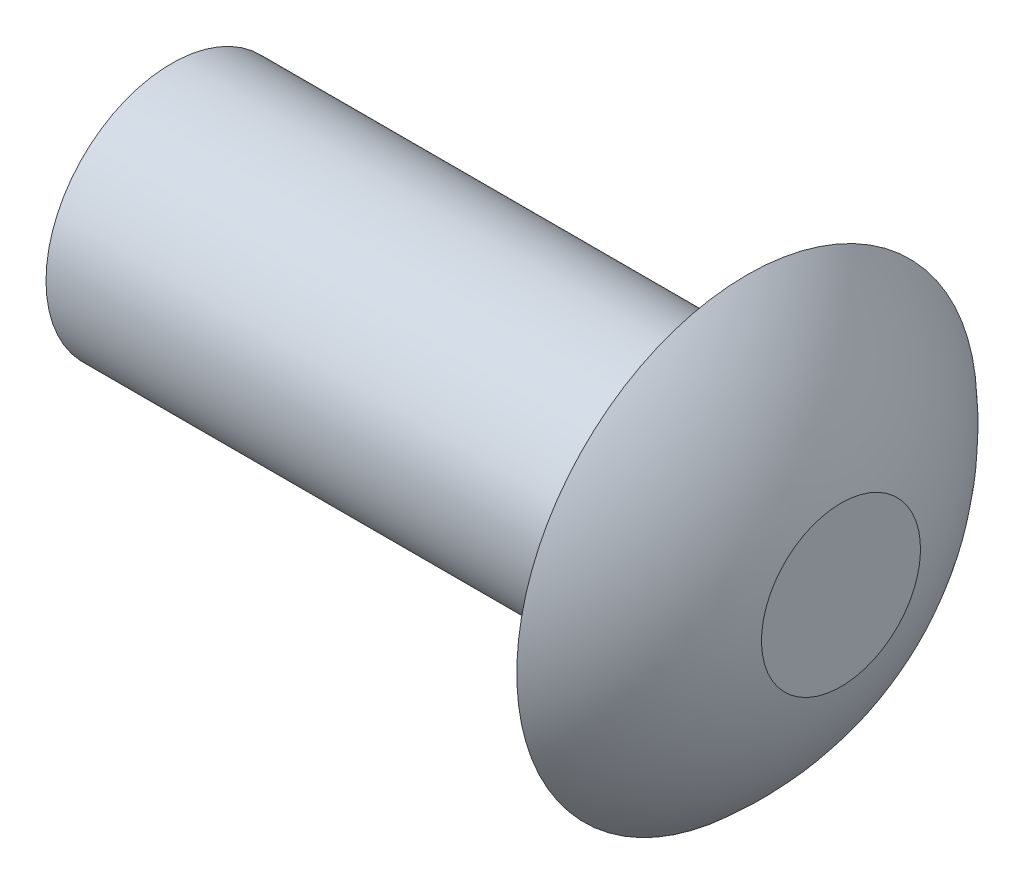
ISO-10303-21;
HEADER;
FILE_DESCRIPTION(('STEP AP214'),'2;1');
FILE_NAME('part.step','',(''),(''),'','','');
FILE_SCHEMA(('AUTOMOTIVE_DESIGN { 1 0 10303 214 1 1 1 1 }'));
ENDSEC;
DATA;
#1=APPLICATION_CONTEXT('core data for automotive mechanical design processes');
#2=APPLICATION_PROTOCOL_DEFINITION('international standard','automotive_design',2000,#1);
#3=PRODUCT_CONTEXT('',#1,'mechanical');
#4=PRODUCT('Part','Part','',(#3));
#5=PRODUCT_RELATED_PRODUCT_CATEGORY('part','',(#4));
#6=PRODUCT_DEFINITION_FORMATION('','',#4);
#7=PRODUCT_DEFINITION_CONTEXT('part definition',#1,'design');
#8=PRODUCT_DEFINITION('design','',#6,#7);
#9=PRODUCT_DEFINITION_SHAPE('','',#8);
#10=(LENGTH_UNIT() NAMED_UNIT(*) SI_UNIT(.MILLI.,.METRE.));
#11=(NAMED_UNIT(*) PLANE_ANGLE_UNIT() SI_UNIT($,.RADIAN.));
#12=(NAMED_UNIT(*) SI_UNIT($,.STERADIAN.) SOLID_ANGLE_UNIT());
#13=UNCERTAINTY_MEASURE_WITH_UNIT(LENGTH_MEASURE(1.E-05),#10,'distance_accuracy_value','');
#14=(GEOMETRIC_REPRESENTATION_CONTEXT(3) GLOBAL_UNCERTAINTY_ASSIGNED_CONTEXT((#13)) GLOBAL_UNIT_ASSIGNED_CONTEXT((#10,
#11,#12)) REPRESENTATION_CONTEXT('',''));
#15=CARTESIAN_POINT('',(0.,0.,0.));
#16=DIRECTION('',(0.,0.,1.));
#17=DIRECTION('',(1.,0.,0.));
#18=AXIS2_PLACEMENT_3D('',#15,#16,#17);
#19=CARTESIAN_POINT('',(-2.4,0.,0.));
#20=DIRECTION('',(-1.,0.,0.));
#21=DIRECTION('',(0.,1.,0.));
#22=AXIS2_PLACEMENT_3D('',#19,#20,#21);
#23=SPHERICAL_SURFACE('',#22,3.65);
#24=CARTESIAN_POINT('',(0.,0.,0.));
#25=DIRECTION('',(-1.,0.,0.));
#26=DIRECTION('',(0.,0.,1.));
#27=AXIS2_PLACEMENT_3D('',#24,#25,#26);
#28=CIRCLE('',#27,2.75);
#29=CARTESIAN_POINT('',(0.,2.75,0.));
#30=VERTEX_POINT('',#29);
#31=EDGE_CURVE('E44',#30,#30,#28,.T.);
#32=CARTESIAN_POINT('',(1.1242020373412,0.,0.));
#33=DIRECTION('',(-1.,0.,0.));
#34=DIRECTION('',(0.,0.,1.));
#35=AXIS2_PLACEMENT_3D('',#32,#33,#34);
#36=CIRCLE('',#35,0.95);
#37=CARTESIAN_POINT('',(1.1242020373412,0.950000000000054,0.));
#38=VERTEX_POINT('',#37);
#39=EDGE_CURVE('E10',#38,#38,#36,.T.);
#40=CARTESIAN_POINT('',(0.,2.75,0.));
#41=CARTESIAN_POINT('',(0.0168995988637001,2.73525129266401,0.));
#42=CARTESIAN_POINT('',(0.0336632114575486,2.72034676895265,0.));
#43=CARTESIAN_POINT('',(0.0669128410145665,2.69023123657844,0.));
#44=CARTESIAN_POINT('',(0.0833988579777359,2.67502022791558,0.));
#45=CARTESIAN_POINT('',(0.11608767318242,2.64429687343758,0.));
#46=CARTESIAN_POINT('',(0.132290471423934,2.62878452762243,0.));
#47=CARTESIAN_POINT('',(0.164407347633022,2.59746377696663,0.));
#48=CARTESIAN_POINT('',(0.180321425600595,2.58165537212598,0.));
#49=CARTESIAN_POINT('',(0.211855451063929,2.54974787468967,0.));
#50=CARTESIAN_POINT('',(0.22747539855969,2.53364878209401,0.));
#51=CARTESIAN_POINT('',(0.258415854663592,2.50116538121903,0.));
#52=CARTESIAN_POINT('',(0.273736363271734,2.48478107293972,0.));
#53=CARTESIAN_POINT('',(0.304072734469466,2.45173280916899,0.));
#54=CARTESIAN_POINT('',(0.319088597059055,2.43506885367756,0.));
#55=CARTESIAN_POINT('',(0.348810572760037,2.40146695914257,0.));
#56=CARTESIAN_POINT('',(0.363516685871429,2.384529020099,0.));
#57=CARTESIAN_POINT('',(0.392614164396958,2.35038491520076,0.));
#58=CARTESIAN_POINT('',(0.407005529811094,2.33317874934609,0.));
#59=CARTESIAN_POINT('',(0.435468621706671,2.2985040387401,0.));
#60=CARTESIAN_POINT('',(0.449540348188112,2.28103549398877,0.));
#61=CARTESIAN_POINT('',(0.477359379617014,2.24584196267665,0.));
#62=CARTESIAN_POINT('',(0.491106684564476,2.22811697611585,0.));
#63=CARTESIAN_POINT('',(0.518272200586947,2.1924165854304,0.));
#64=CARTESIAN_POINT('',(0.531690411661957,2.17444118130574,0.));
#65=CARTESIAN_POINT('',(0.558193179451015,2.13824606484812,0.));
#66=CARTESIAN_POINT('',(0.571277736165062,2.12002635251517,0.));
#67=CARTESIAN_POINT('',(0.597108748143862,2.0833488120304,0.));
#68=CARTESIAN_POINT('',(0.609855203408614,2.06489098387858,0.));
#69=CARTESIAN_POINT('',(0.635005680312052,2.02774348507461,0.));
#70=CARTESIAN_POINT('',(0.647409701950737,2.00905381442247,0.));
#71=CARTESIAN_POINT('',(0.671871095809237,1.97144898273344,0.));
#72=CARTESIAN_POINT('',(0.683928468029051,1.95253382169655,0.));
#73=CARTESIAN_POINT('',(0.707692465073805,1.91448443799172,0.));
#74=CARTESIAN_POINT('',(0.719399089898743,1.89535021532377,0.));
#75=CARTESIAN_POINT('',(0.742457613387331,1.85686921156364,0.));
#76=CARTESIAN_POINT('',(0.753809512050979,1.83752243047146,0.));
#77=CARTESIAN_POINT('',(0.776154725012438,1.79862288531257,0.));
#78=CARTESIAN_POINT('',(0.787148039310248,1.77907012124587,0.));
#79=CARTESIAN_POINT('',(0.80877234720865,1.73976525559573,0.));
#80=CARTESIAN_POINT('',(0.819403340809243,1.72001315401228,0.));
#81=CARTESIAN_POINT('',(0.84029939412486,1.68031632653587,0.));
#82=CARTESIAN_POINT('',(0.850564453839883,1.66037160064291,0.));
#83=CARTESIAN_POINT('',(0.870725150567148,1.62029630322252,0.));
#84=CARTESIAN_POINT('',(0.88062078757939,1.60016573169509,0.));
#85=CARTESIAN_POINT('',(0.900039275640444,1.55972558484469,0.));
#86=CARTESIAN_POINT('',(0.909562126689257,1.53941600952171,0.));
#87=CARTESIAN_POINT('',(0.928231806263677,1.49862475775796,0.));
#88=CARTESIAN_POINT('',(0.937378634789283,1.47814308131718,0.));
#89=CARTESIAN_POINT('',(0.95529316055385,1.43701458848707,0.));
#90=CARTESIAN_POINT('',(0.96406085779281,1.41636777209774,0.));
#91=CARTESIAN_POINT('',(0.981214141090544,1.37491601667028,0.));
#92=CARTESIAN_POINT('',(0.989599727149318,1.35411107763214,0.));
#93=CARTESIAN_POINT('',(1.00598593801247,1.31235014793398,0.));
#94=CARTESIAN_POINT('',(1.01398656281685,1.29139415727395,0.));
#95=CARTESIAN_POINT('',(1.02960013212143,1.24933824675126,0.));
#96=CARTESIAN_POINT('',(1.03721307662163,1.22823832688859,0.));
#97=CARTESIAN_POINT('',(1.05204869733427,1.18590172909613,0.));
#98=CARTESIAN_POINT('',(1.05927137354671,1.16466505116632,0.));
#99=CARTESIAN_POINT('',(1.07332400493903,1.12206215560717,0.));
#100=CARTESIAN_POINT('',(1.08015396011892,1.10069593797782,0.));
#101=CARTESIAN_POINT('',(1.09341882048405,1.05784122260879,0.));
#102=CARTESIAN_POINT('',(1.0998537256693,1.03635272486911,0.));
#103=CARTESIAN_POINT('',(1.1123263275232,0.993260760898373,0.));
#104=CARTESIAN_POINT('',(1.11836402419184,0.971657294667317,0.));
#105=CARTESIAN_POINT('',(1.1242020373412,0.950000000000054,0.));
#106=B_SPLINE_CURVE_WITH_KNOTS('',3,(#40,#41,#42,#43,#44,#45,#46,#47,#48,#49,#50,#51,#52,#53,
#54,#55,#56,#57,#58,#59,#60,#61,#62,#63,#64,#65,#66,#67,#68,#69,#70,#71,#72,#73,#74,#75,#76,#77,
#78,#79,#80,#81,#82,#83,#84,#85,#86,#87,#88,#89,#90,#91,#92,#93,#94,#95,#96,#97,#98,#99,#100,
#101,#102,#103,#104,#105),.UNSPECIFIED.,.F.,.F.,(4,2,2,2,2,2,2,2,2,2,2,2,2,2,2,2,2,2,2,2,2,2,2,
2,2,2,2,2,2,2,2,2,4),(0.,0.0672901096478356,0.134580219295671,0.201870328943508,
0.269160438591343,0.33645054823918,0.403740657887015,0.471030767534852,0.538320877182687,
0.605610986830523,0.672901096478359,0.740191206126195,0.807481315774031,0.874771425421866,
0.942061535069703,1.00935164471754,1.07664175436537,1.14393186401321,1.21122197366105,
1.27851208330888,1.34580219295672,1.41309230260455,1.48038241225239,1.54767252190023,
1.61496263154806,1.6822527411959,1.74954285084373,1.81683296049157,1.88412307013941,
1.95141317978724,2.01870328943508,2.08599339908291,2.15328350873075),.UNSPECIFIED.);
#107=EDGE_CURVE('BSEAM30',#30,#38,#106,.T.);
#108=ORIENTED_EDGE('',*,*,#31,.F.);
#109=ORIENTED_EDGE('',*,*,#39,.T.);
#110=ORIENTED_EDGE('',*,*,#107,.T.);
#111=ORIENTED_EDGE('',*,*,#107,.F.);
#112=EDGE_LOOP('',(#108,#110,#109,#111));
#113=FACE_BOUND('',#112,.T.);
#114=ADVANCED_FACE('F30',(#113),#23,.T.);
#115=CARTESIAN_POINT('',(1.12420203734238,0.,0.));
#116=DIRECTION('',(-1.,0.,0.));
#117=DIRECTION('',(0.,0.,1.));
#118=AXIS2_PLACEMENT_3D('',#115,#116,#117);
#119=PLANE('',#118);
#120=ORIENTED_EDGE('',*,*,#39,.F.);
#121=EDGE_LOOP('',(#120));
#122=FACE_BOUND('',#121,.T.);
#123=ADVANCED_FACE('F53',(#122),#119,.F.);
#124=CARTESIAN_POINT('',(-6.87579796265878,0.,0.));
#125=DIRECTION('',(1.,0.,0.));
#126=DIRECTION('',(0.,0.,-1.));
#127=AXIS2_PLACEMENT_3D('',#124,#125,#126);
#128=PLANE('',#127);
#129=CARTESIAN_POINT('',(-6.8757979626588,0.,0.));
#130=DIRECTION('',(-1.,0.,0.));
#131=DIRECTION('',(0.,0.,1.));
#132=AXIS2_PLACEMENT_3D('',#129,#130,#131);
#133=CIRCLE('',#132,1.5);
#134=CARTESIAN_POINT('',(-6.8757979626588,0.,1.5));
#135=VERTEX_POINT('',#134);
#136=EDGE_CURVE('E36',#135,#135,#133,.T.);
#137=ORIENTED_EDGE('',*,*,#136,.T.);
#138=EDGE_LOOP('',(#137));
#139=FACE_BOUND('',#138,.T.);
#140=ADVANCED_FACE('F57',(#139),#128,.F.);
#141=CARTESIAN_POINT('',(-1000.,0.,0.));
#142=DIRECTION('',(-1.,0.,0.));
#143=DIRECTION('',(0.,0.,1.));
#144=AXIS2_PLACEMENT_3D('',#141,#142,#143);
#145=CYLINDRICAL_SURFACE('',#144,1.5);
#146=ORIENTED_EDGE('',*,*,#136,.F.);
#147=EDGE_LOOP('',(#146));
#148=FACE_BOUND('',#147,.T.);
#149=CARTESIAN_POINT('',(0.,0.,0.));
#150=DIRECTION('',(-1.,0.,0.));
#151=DIRECTION('',(0.,0.,1.));
#152=AXIS2_PLACEMENT_3D('',#149,#150,#151);
#153=CIRCLE('',#152,1.5);
#154=CARTESIAN_POINT('',(0.,0.,1.5));
#155=VERTEX_POINT('',#154);
#156=EDGE_CURVE('E40',#155,#155,#153,.T.);
#157=ORIENTED_EDGE('',*,*,#156,.T.);
#158=EDGE_LOOP('',(#157));
#159=FACE_BOUND('',#158,.T.);
#160=ADVANCED_FACE('F62',(#148,#159),#145,.T.);
#161=CARTESIAN_POINT('',(0.,2.75,0.));
#162=DIRECTION('',(1.,0.,0.));
#163=DIRECTION('',(0.,0.,-1.));
#164=AXIS2_PLACEMENT_3D('',#161,#162,#163);
#165=PLANE('',#164);
#166=ORIENTED_EDGE('',*,*,#156,.F.);
#167=EDGE_LOOP('',(#166));
#168=FACE_BOUND('',#167,.T.);
#169=ORIENTED_EDGE('',*,*,#31,.T.);
#170=EDGE_LOOP('',(#169));
#171=FACE_BOUND('',#170,.T.);
#172=ADVANCED_FACE('F50',(#168,#171),#165,.F.);
#173=CLOSED_SHELL('',(#114,#123,#140,#160,#172));
#174=MANIFOLD_SOLID_BREP('B2',#173);
#175=ADVANCED_BREP_SHAPE_REPRESENTATION('',(#18,#174),#14);
#176=SHAPE_DEFINITION_REPRESENTATION(#9,#175);
ENDSEC;
END-ISO-10303-21;
